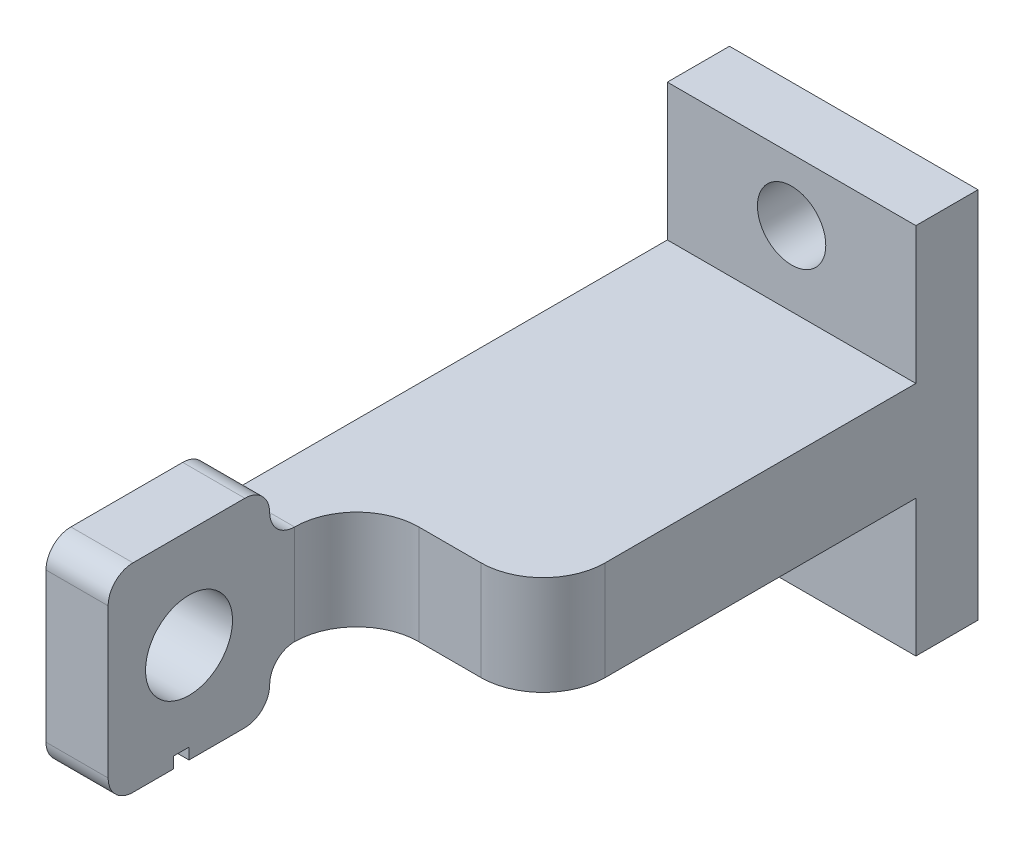
ISO-10303-21;
HEADER;
FILE_DESCRIPTION(('STEP AP214'),'2;1');
FILE_NAME('part.step','',(''),(''),'','','');
FILE_SCHEMA(('AUTOMOTIVE_DESIGN { 1 0 10303 214 1 1 1 1 }'));
ENDSEC;
DATA;
#1=APPLICATION_CONTEXT('core data for automotive mechanical design processes');
#2=APPLICATION_PROTOCOL_DEFINITION('international standard','automotive_design',2000,#1);
#3=PRODUCT_CONTEXT('',#1,'mechanical');
#4=PRODUCT('Part','Part','',(#3));
#5=PRODUCT_RELATED_PRODUCT_CATEGORY('part','',(#4));
#6=PRODUCT_DEFINITION_FORMATION('','',#4);
#7=PRODUCT_DEFINITION_CONTEXT('part definition',#1,'design');
#8=PRODUCT_DEFINITION('design','',#6,#7);
#9=PRODUCT_DEFINITION_SHAPE('','',#8);
#10=(LENGTH_UNIT() NAMED_UNIT(*) SI_UNIT(.MILLI.,.METRE.));
#11=(NAMED_UNIT(*) PLANE_ANGLE_UNIT() SI_UNIT($,.RADIAN.));
#12=(NAMED_UNIT(*) SI_UNIT($,.STERADIAN.) SOLID_ANGLE_UNIT());
#13=UNCERTAINTY_MEASURE_WITH_UNIT(LENGTH_MEASURE(1.E-05),#10,'distance_accuracy_value','');
#14=(GEOMETRIC_REPRESENTATION_CONTEXT(3) GLOBAL_UNCERTAINTY_ASSIGNED_CONTEXT((#13)) GLOBAL_UNIT_ASSIGNED_CONTEXT((#10,
#11,#12)) REPRESENTATION_CONTEXT('',''));
#15=CARTESIAN_POINT('',(0.,0.,0.));
#16=DIRECTION('',(0.,0.,1.));
#17=DIRECTION('',(1.,0.,0.));
#18=AXIS2_PLACEMENT_3D('',#15,#16,#17);
#19=CARTESIAN_POINT('',(10.,-35.7591402081995,0.));
#20=DIRECTION('',(0.,1.,0.));
#21=DIRECTION('',(-1.,0.,0.));
#22=AXIS2_PLACEMENT_3D('',#19,#20,#21);
#23=PLANE('',#22);
#24=DIRECTION('',(0.,0.,-1.));
#25=VECTOR('',#24,1.);
#26=CARTESIAN_POINT('',(5.,-35.7591402081995,0.));
#27=LINE('',#26,#25);
#28=CARTESIAN_POINT('',(5.,-35.7591402081995,48.4905528775903));
#29=VERTEX_POINT('',#28);
#30=CARTESIAN_POINT('',(5.,-35.7591402081995,44.));
#31=VERTEX_POINT('',#30);
#32=EDGE_CURVE('E235',#29,#31,#27,.T.);
#33=ORIENTED_EDGE('',*,*,#32,.T.);
#34=DIRECTION('',(-1.,0.,0.));
#35=VECTOR('',#34,1.);
#36=CARTESIAN_POINT('',(10.,-35.7591402081995,44.));
#37=LINE('',#36,#35);
#38=CARTESIAN_POINT('',(10.,-35.7591402081995,44.));
#39=VERTEX_POINT('',#38);
#40=EDGE_CURVE('E353',#31,#39,#37,.F.);
#41=ORIENTED_EDGE('',*,*,#40,.T.);
#42=DIRECTION('',(0.,0.,-1.));
#43=VECTOR('',#42,1.);
#44=CARTESIAN_POINT('',(10.,-35.7591402081995,0.));
#45=LINE('',#44,#43);
#46=CARTESIAN_POINT('',(10.,-35.7591402081995,48.4905528775903));
#47=VERTEX_POINT('',#46);
#48=EDGE_CURVE('E242',#47,#39,#45,.T.);
#49=ORIENTED_EDGE('',*,*,#48,.F.);
#50=DIRECTION('',(-1.,0.,0.));
#51=VECTOR('',#50,1.);
#52=CARTESIAN_POINT('',(10.,-35.7591402081995,48.4905528775903));
#53=LINE('',#52,#51);
#54=EDGE_CURVE('E198',#47,#29,#53,.T.);
#55=ORIENTED_EDGE('',*,*,#54,.T.);
#56=EDGE_LOOP('',(#33,#41,#49,#55));
#57=FACE_BOUND('',#56,.T.);
#58=ADVANCED_FACE('F35',(#57),#23,.F.);
#59=CARTESIAN_POINT('',(0.,-23.7591402081995,55.));
#60=DIRECTION('',(0.,-1.,0.));
#61=DIRECTION('',(0.,0.,-1.));
#62=AXIS2_PLACEMENT_3D('',#59,#60,#61);
#63=PLANE('',#62);
#64=DIRECTION('',(0.,0.,-1.));
#65=VECTOR('',#64,1.);
#66=CARTESIAN_POINT('',(5.,-23.7591402081995,55.));
#67=LINE('',#66,#65);
#68=CARTESIAN_POINT('',(5.,-23.7591402081995,40.));
#69=VERTEX_POINT('',#68);
#70=CARTESIAN_POINT('',(5.,-23.7591402081995,5.));
#71=VERTEX_POINT('',#70);
#72=EDGE_CURVE('E264',#69,#71,#67,.T.);
#73=ORIENTED_EDGE('',*,*,#72,.F.);
#74=DIRECTION('',(-1.,0.,0.));
#75=VECTOR('',#74,1.);
#76=CARTESIAN_POINT('',(10.,-23.7591402081995,40.));
#77=LINE('',#76,#75);
#78=CARTESIAN_POINT('',(10.,-23.7591402081995,40.));
#79=VERTEX_POINT('',#78);
#80=EDGE_CURVE('E339',#69,#79,#77,.F.);
#81=ORIENTED_EDGE('',*,*,#80,.T.);
#82=CARTESIAN_POINT('',(15.,-23.7591402081995,40.));
#83=DIRECTION('',(0.,-1.,0.));
#84=DIRECTION('',(0.,0.,-1.));
#85=AXIS2_PLACEMENT_3D('',#82,#83,#84);
#86=CIRCLE('',#85,5.);
#87=CARTESIAN_POINT('',(15.,-23.7591402081995,35.));
#88=VERTEX_POINT('',#87);
#89=EDGE_CURVE('E332',#79,#88,#86,.T.);
#90=ORIENTED_EDGE('',*,*,#89,.T.);
#91=DIRECTION('',(-1.,0.,0.));
#92=VECTOR('',#91,1.);
#93=CARTESIAN_POINT('',(25.,-23.7591402081995,35.));
#94=LINE('',#93,#92);
#95=CARTESIAN_POINT('',(20.,-23.7591402081995,35.));
#96=VERTEX_POINT('',#95);
#97=EDGE_CURVE('E247',#96,#88,#94,.T.);
#98=ORIENTED_EDGE('',*,*,#97,.F.);
#99=CARTESIAN_POINT('',(20.,-23.7591402081995,30.));
#100=DIRECTION('',(0.,-1.,0.));
#101=DIRECTION('',(0.,0.,-1.));
#102=AXIS2_PLACEMENT_3D('',#99,#100,#101);
#103=CIRCLE('',#102,5.);
#104=CARTESIAN_POINT('',(25.,-23.7591402081995,30.));
#105=VERTEX_POINT('',#104);
#106=EDGE_CURVE('E320',#96,#105,#103,.F.);
#107=ORIENTED_EDGE('',*,*,#106,.T.);
#108=DIRECTION('',(0.,0.,-1.));
#109=VECTOR('',#108,1.);
#110=CARTESIAN_POINT('',(25.,-23.7591402081995,55.));
#111=LINE('',#110,#109);
#112=CARTESIAN_POINT('',(25.,-23.7591402081995,5.));
#113=VERTEX_POINT('',#112);
#114=EDGE_CURVE('E266',#105,#113,#111,.T.);
#115=ORIENTED_EDGE('',*,*,#114,.T.);
#116=DIRECTION('',(-1.,0.,0.));
#117=VECTOR('',#116,1.);
#118=CARTESIAN_POINT('',(0.,-23.7591402081995,5.));
#119=LINE('',#118,#117);
#120=EDGE_CURVE('E252',#113,#71,#119,.T.);
#121=ORIENTED_EDGE('',*,*,#120,.T.);
#122=EDGE_LOOP('',(#73,#81,#90,#98,#107,#115,#121));
#123=FACE_BOUND('',#122,.T.);
#124=ADVANCED_FACE('F410',(#123),#63,.F.);
#125=CARTESIAN_POINT('',(0.,-31.7591402081995,55.));
#126=DIRECTION('',(0.,-1.,0.));
#127=DIRECTION('',(0.,0.,-1.));
#128=AXIS2_PLACEMENT_3D('',#125,#126,#127);
#129=PLANE('',#128);
#130=CARTESIAN_POINT('',(15.,-31.7591402081995,40.));
#131=DIRECTION('',(0.,-1.,0.));
#132=DIRECTION('',(0.,0.,-1.));
#133=AXIS2_PLACEMENT_3D('',#130,#131,#132);
#134=CIRCLE('',#133,5.);
#135=CARTESIAN_POINT('',(15.,-31.7591402081995,35.));
#136=VERTEX_POINT('',#135);
#137=CARTESIAN_POINT('',(10.,-31.7591402081995,40.));
#138=VERTEX_POINT('',#137);
#139=EDGE_CURVE('E329',#136,#138,#134,.F.);
#140=ORIENTED_EDGE('',*,*,#139,.T.);
#141=DIRECTION('',(-1.,0.,0.));
#142=VECTOR('',#141,1.);
#143=CARTESIAN_POINT('',(0.,-31.7591402081995,40.));
#144=LINE('',#143,#142);
#145=CARTESIAN_POINT('',(5.,-31.7591402081995,40.));
#146=VERTEX_POINT('',#145);
#147=EDGE_CURVE('E342',#138,#146,#144,.T.);
#148=ORIENTED_EDGE('',*,*,#147,.T.);
#149=DIRECTION('',(0.,0.,-1.));
#150=VECTOR('',#149,1.);
#151=CARTESIAN_POINT('',(5.,-31.7591402081995,55.));
#152=LINE('',#151,#150);
#153=CARTESIAN_POINT('',(5.,-31.7591402081995,5.));
#154=VERTEX_POINT('',#153);
#155=EDGE_CURVE('E262',#146,#154,#152,.T.);
#156=ORIENTED_EDGE('',*,*,#155,.T.);
#157=DIRECTION('',(-1.,0.,0.));
#158=VECTOR('',#157,1.);
#159=CARTESIAN_POINT('',(0.,-31.7591402081995,5.));
#160=LINE('',#159,#158);
#161=CARTESIAN_POINT('',(25.,-31.7591402081995,5.));
#162=VERTEX_POINT('',#161);
#163=EDGE_CURVE('E256',#162,#154,#160,.T.);
#164=ORIENTED_EDGE('',*,*,#163,.F.);
#165=DIRECTION('',(0.,0.,-1.));
#166=VECTOR('',#165,1.);
#167=CARTESIAN_POINT('',(25.,-31.7591402081995,55.));
#168=LINE('',#167,#166);
#169=CARTESIAN_POINT('',(25.,-31.7591402081995,30.));
#170=VERTEX_POINT('',#169);
#171=EDGE_CURVE('E255',#170,#162,#168,.T.);
#172=ORIENTED_EDGE('',*,*,#171,.F.);
#173=CARTESIAN_POINT('',(20.,-31.7591402081995,30.));
#174=DIRECTION('',(0.,-1.,0.));
#175=DIRECTION('',(0.,0.,-1.));
#176=AXIS2_PLACEMENT_3D('',#173,#174,#175);
#177=CIRCLE('',#176,5.);
#178=CARTESIAN_POINT('',(20.,-31.7591402081995,35.));
#179=VERTEX_POINT('',#178);
#180=EDGE_CURVE('E324',#170,#179,#177,.T.);
#181=ORIENTED_EDGE('',*,*,#180,.T.);
#182=DIRECTION('',(1.,0.,0.));
#183=VECTOR('',#182,1.);
#184=CARTESIAN_POINT('',(10.,-31.7591402081995,35.));
#185=LINE('',#184,#183);
#186=EDGE_CURVE('E241',#136,#179,#185,.T.);
#187=ORIENTED_EDGE('',*,*,#186,.F.);
#188=EDGE_LOOP('',(#140,#148,#156,#164,#172,#181,#187));
#189=FACE_BOUND('',#188,.T.);
#190=ADVANCED_FACE('F403',(#189),#129,.T.);
#191=CARTESIAN_POINT('',(25.,0.,5.));
#192=DIRECTION('',(1.,0.,0.));
#193=DIRECTION('',(0.,1.,0.));
#194=AXIS2_PLACEMENT_3D('',#191,#192,#193);
#195=PLANE('',#194);
#196=ORIENTED_EDGE('',*,*,#114,.F.);
#197=DIRECTION('',(0.,1.,0.));
#198=VECTOR('',#197,1.);
#199=CARTESIAN_POINT('',(25.,0.,30.));
#200=LINE('',#199,#198);
#201=EDGE_CURVE('E322',#105,#170,#200,.F.);
#202=ORIENTED_EDGE('',*,*,#201,.T.);
#203=ORIENTED_EDGE('',*,*,#171,.T.);
#204=DIRECTION('',(0.,-1.,0.));
#205=VECTOR('',#204,1.);
#206=CARTESIAN_POINT('',(25.,0.,5.));
#207=LINE('',#206,#205);
#208=CARTESIAN_POINT('',(25.,-42.7591402081995,5.));
#209=VERTEX_POINT('',#208);
#210=EDGE_CURVE('E273',#162,#209,#207,.T.);
#211=ORIENTED_EDGE('',*,*,#210,.T.);
#212=DIRECTION('',(0.,0.,-1.));
#213=VECTOR('',#212,1.);
#214=CARTESIAN_POINT('',(25.,-42.7591402081995,5.));
#215=LINE('',#214,#213);
#216=CARTESIAN_POINT('',(25.,-42.7591402081995,0.));
#217=VERTEX_POINT('',#216);
#218=EDGE_CURVE('E289',#209,#217,#215,.T.);
#219=ORIENTED_EDGE('',*,*,#218,.T.);
#220=DIRECTION('',(0.,-1.,0.));
#221=VECTOR('',#220,1.);
#222=CARTESIAN_POINT('',(25.,0.,0.));
#223=LINE('',#222,#221);
#224=CARTESIAN_POINT('',(25.,-12.7591402081995,0.));
#225=VERTEX_POINT('',#224);
#226=EDGE_CURVE('E268',#225,#217,#223,.T.);
#227=ORIENTED_EDGE('',*,*,#226,.F.);
#228=DIRECTION('',(0.,0.,-1.));
#229=VECTOR('',#228,1.);
#230=CARTESIAN_POINT('',(25.,-12.7591402081995,5.));
#231=LINE('',#230,#229);
#232=CARTESIAN_POINT('',(25.,-12.7591402081995,5.));
#233=VERTEX_POINT('',#232);
#234=EDGE_CURVE('E312',#233,#225,#231,.T.);
#235=ORIENTED_EDGE('',*,*,#234,.F.);
#236=EDGE_CURVE('E269',#233,#113,#207,.T.);
#237=ORIENTED_EDGE('',*,*,#236,.T.);
#238=EDGE_LOOP('',(#196,#202,#203,#211,#219,#227,#235,#237));
#239=FACE_BOUND('',#238,.T.);
#240=ADVANCED_FACE('F422',(#239),#195,.T.);
#241=CARTESIAN_POINT('',(0.,0.,5.));
#242=DIRECTION('',(0.,0.,1.));
#243=DIRECTION('',(1.,0.,0.));
#244=AXIS2_PLACEMENT_3D('',#241,#242,#243);
#245=PLANE('',#244);
#246=CARTESIAN_POINT('',(15.,-35.9197134027332,5.));
#247=DIRECTION('',(0.,0.,1.));
#248=DIRECTION('',(1.,0.,0.));
#249=AXIS2_PLACEMENT_3D('',#246,#247,#248);
#250=CIRCLE('',#249,2.75);
#251=CARTESIAN_POINT('',(17.75,-35.9197134027332,5.));
#252=VERTEX_POINT('',#251);
#253=EDGE_CURVE('E286',#252,#252,#250,.T.);
#254=ORIENTED_EDGE('',*,*,#253,.F.);
#255=EDGE_LOOP('',(#254));
#256=FACE_BOUND('',#255,.T.);
#257=ORIENTED_EDGE('',*,*,#210,.F.);
#258=ORIENTED_EDGE('',*,*,#163,.T.);
#259=DIRECTION('',(0.,1.,0.));
#260=VECTOR('',#259,1.);
#261=CARTESIAN_POINT('',(5.,0.,5.));
#262=LINE('',#261,#260);
#263=CARTESIAN_POINT('',(5.,-42.7591402081995,5.));
#264=VERTEX_POINT('',#263);
#265=EDGE_CURVE('E277',#264,#154,#262,.T.);
#266=ORIENTED_EDGE('',*,*,#265,.F.);
#267=DIRECTION('',(-1.,0.,0.));
#268=VECTOR('',#267,1.);
#269=CARTESIAN_POINT('',(0.,-42.7591402081995,5.));
#270=LINE('',#269,#268);
#271=EDGE_CURVE('E280',#209,#264,#270,.T.);
#272=ORIENTED_EDGE('',*,*,#271,.F.);
#273=EDGE_LOOP('',(#257,#258,#266,#272));
#274=FACE_BOUND('',#273,.T.);
#275=ADVANCED_FACE('F640',(#256,#274),#245,.T.);
#276=CARTESIAN_POINT('',(0.,-12.7591402081995,5.));
#277=DIRECTION('',(0.,1.,0.));
#278=DIRECTION('',(0.,0.,1.));
#279=AXIS2_PLACEMENT_3D('',#276,#277,#278);
#280=PLANE('',#279);
#281=DIRECTION('',(1.,0.,0.));
#282=VECTOR('',#281,1.);
#283=CARTESIAN_POINT('',(0.,-12.7591402081995,0.));
#284=LINE('',#283,#282);
#285=CARTESIAN_POINT('',(5.,-12.7591402081995,0.));
#286=VERTEX_POINT('',#285);
#287=EDGE_CURVE('E292',#286,#225,#284,.T.);
#288=ORIENTED_EDGE('',*,*,#287,.F.);
#289=DIRECTION('',(0.,0.,-1.));
#290=VECTOR('',#289,1.);
#291=CARTESIAN_POINT('',(5.,-12.7591402081995,5.));
#292=LINE('',#291,#290);
#293=CARTESIAN_POINT('',(5.,-12.7591402081995,5.));
#294=VERTEX_POINT('',#293);
#295=EDGE_CURVE('E310',#294,#286,#292,.T.);
#296=ORIENTED_EDGE('',*,*,#295,.F.);
#297=DIRECTION('',(1.,0.,0.));
#298=VECTOR('',#297,1.);
#299=CARTESIAN_POINT('',(0.,-12.7591402081995,5.));
#300=LINE('',#299,#298);
#301=EDGE_CURVE('E272',#294,#233,#300,.T.);
#302=ORIENTED_EDGE('',*,*,#301,.T.);
#303=ORIENTED_EDGE('',*,*,#234,.T.);
#304=EDGE_LOOP('',(#288,#296,#302,#303));
#305=FACE_BOUND('',#304,.T.);
#306=ADVANCED_FACE('F434',(#305),#280,.T.);
#307=CARTESIAN_POINT('',(5.,0.,5.));
#308=DIRECTION('',(-1.,0.,0.));
#309=DIRECTION('',(0.,-1.,0.));
#310=AXIS2_PLACEMENT_3D('',#307,#308,#309);
#311=PLANE('',#310);
#312=ORIENTED_EDGE('',*,*,#155,.F.);
#313=CARTESIAN_POINT('',(5.,-33.7591402081995,40.));
#314=DIRECTION('',(-1.,0.,0.));
#315=DIRECTION('',(0.,-1.,0.));
#316=AXIS2_PLACEMENT_3D('',#313,#314,#315);
#317=CIRCLE('',#316,2.);
#318=CARTESIAN_POINT('',(5.,-33.7591402081995,42.));
#319=VERTEX_POINT('',#318);
#320=EDGE_CURVE('E44',#146,#319,#317,.F.);
#321=ORIENTED_EDGE('',*,*,#320,.T.);
#322=CARTESIAN_POINT('',(5.,-33.7591402081995,44.));
#323=DIRECTION('',(-1.,0.,0.));
#324=DIRECTION('',(0.,-1.,0.));
#325=AXIS2_PLACEMENT_3D('',#322,#323,#324);
#326=CIRCLE('',#325,2.);
#327=EDGE_CURVE('E351',#319,#31,#326,.T.);
#328=ORIENTED_EDGE('',*,*,#327,.T.);
#329=ORIENTED_EDGE('',*,*,#32,.F.);
#330=DIRECTION('',(0.,1.,0.));
#331=VECTOR('',#330,1.);
#332=CARTESIAN_POINT('',(5.,0.,48.4905528775903));
#333=LINE('',#332,#331);
#334=CARTESIAN_POINT('',(5.,-34.8591402081995,48.4905528775903));
#335=VERTEX_POINT('',#334);
#336=EDGE_CURVE('E218',#29,#335,#333,.T.);
#337=ORIENTED_EDGE('',*,*,#336,.T.);
#338=DIRECTION('',(0.,0.,1.));
#339=VECTOR('',#338,1.);
#340=CARTESIAN_POINT('',(5.,-34.8591402081995,0.));
#341=LINE('',#340,#339);
#342=CARTESIAN_POINT('',(5.,-34.8591402081995,49.7405528775903));
#343=VERTEX_POINT('',#342);
#344=EDGE_CURVE('E210',#335,#343,#341,.T.);
#345=ORIENTED_EDGE('',*,*,#344,.T.);
#346=DIRECTION('',(0.,1.,0.));
#347=VECTOR('',#346,1.);
#348=CARTESIAN_POINT('',(5.,0.,49.7405528775903));
#349=LINE('',#348,#347);
#350=CARTESIAN_POINT('',(5.,-35.7591402081995,49.7405528775903));
#351=VERTEX_POINT('',#350);
#352=EDGE_CURVE('E216',#351,#343,#349,.T.);
#353=ORIENTED_EDGE('',*,*,#352,.F.);
#354=CARTESIAN_POINT('',(5.,-35.7591402081995,53.));
#355=VERTEX_POINT('',#354);
#356=EDGE_CURVE('E243',#355,#351,#27,.T.);
#357=ORIENTED_EDGE('',*,*,#356,.F.);
#358=CARTESIAN_POINT('',(5.,-33.7591402081995,53.));
#359=DIRECTION('',(-1.,0.,0.));
#360=DIRECTION('',(0.,-1.,0.));
#361=AXIS2_PLACEMENT_3D('',#358,#359,#360);
#362=CIRCLE('',#361,2.);
#363=CARTESIAN_POINT('',(5.,-33.7591402081995,55.));
#364=VERTEX_POINT('',#363);
#365=EDGE_CURVE('E345',#355,#364,#362,.T.);
#366=ORIENTED_EDGE('',*,*,#365,.T.);
#367=DIRECTION('',(0.,-1.,0.));
#368=VECTOR('',#367,1.);
#369=CARTESIAN_POINT('',(5.,0.,55.));
#370=LINE('',#369,#368);
#371=CARTESIAN_POINT('',(5.,-21.7591402081995,55.));
#372=VERTEX_POINT('',#371);
#373=EDGE_CURVE('E253',#372,#364,#370,.T.);
#374=ORIENTED_EDGE('',*,*,#373,.F.);
#375=CARTESIAN_POINT('',(5.,-21.7591402081995,53.));
#376=DIRECTION('',(-1.,0.,0.));
#377=DIRECTION('',(0.,-1.,0.));
#378=AXIS2_PLACEMENT_3D('',#375,#376,#377);
#379=CIRCLE('',#378,2.);
#380=CARTESIAN_POINT('',(5.,-19.7591402081995,53.));
#381=VERTEX_POINT('',#380);
#382=EDGE_CURVE('E347',#372,#381,#379,.T.);
#383=ORIENTED_EDGE('',*,*,#382,.T.);
#384=DIRECTION('',(0.,0.,-1.));
#385=VECTOR('',#384,1.);
#386=CARTESIAN_POINT('',(5.,-19.7591402081995,0.));
#387=LINE('',#386,#385);
#388=CARTESIAN_POINT('',(5.,-19.7591402081995,44.));
#389=VERTEX_POINT('',#388);
#390=EDGE_CURVE('E236',#381,#389,#387,.T.);
#391=ORIENTED_EDGE('',*,*,#390,.T.);
#392=CARTESIAN_POINT('',(5.,-21.7591402081995,44.));
#393=DIRECTION('',(-1.,0.,0.));
#394=DIRECTION('',(0.,-1.,0.));
#395=AXIS2_PLACEMENT_3D('',#392,#393,#394);
#396=CIRCLE('',#395,2.);
#397=CARTESIAN_POINT('',(5.,-21.7591402081995,42.));
#398=VERTEX_POINT('',#397);
#399=EDGE_CURVE('E349',#389,#398,#396,.T.);
#400=ORIENTED_EDGE('',*,*,#399,.T.);
#401=CARTESIAN_POINT('',(5.,-21.7591402081995,40.));
#402=DIRECTION('',(-1.,0.,0.));
#403=DIRECTION('',(0.,-1.,0.));
#404=AXIS2_PLACEMENT_3D('',#401,#402,#403);
#405=CIRCLE('',#404,2.);
#406=EDGE_CURVE('E373',#398,#69,#405,.F.);
#407=ORIENTED_EDGE('',*,*,#406,.T.);
#408=ORIENTED_EDGE('',*,*,#72,.T.);
#409=EDGE_CURVE('E276',#71,#294,#262,.T.);
#410=ORIENTED_EDGE('',*,*,#409,.T.);
#411=ORIENTED_EDGE('',*,*,#295,.T.);
#412=DIRECTION('',(0.,1.,0.));
#413=VECTOR('',#412,1.);
#414=CARTESIAN_POINT('',(5.,0.,0.));
#415=LINE('',#414,#413);
#416=CARTESIAN_POINT('',(5.,-42.7591402081995,0.));
#417=VERTEX_POINT('',#416);
#418=EDGE_CURVE('E295',#417,#286,#415,.T.);
#419=ORIENTED_EDGE('',*,*,#418,.F.);
#420=DIRECTION('',(0.,0.,-1.));
#421=VECTOR('',#420,1.);
#422=CARTESIAN_POINT('',(5.,-42.7591402081995,5.));
#423=LINE('',#422,#421);
#424=EDGE_CURVE('E308',#264,#417,#423,.T.);
#425=ORIENTED_EDGE('',*,*,#424,.F.);
#426=ORIENTED_EDGE('',*,*,#265,.T.);
#427=EDGE_LOOP('',(#312,#321,#328,#329,#337,#345,#353,#357,#366,#374,#383,#391,#400,#407,#408,
#410,#411,#419,#425,#426));
#428=FACE_BOUND('',#427,.T.);
#429=CARTESIAN_POINT('',(5.,-27.7591402081995,48.4905528775903));
#430=DIRECTION('',(-1.,0.,0.));
#431=DIRECTION('',(0.,-1.,0.));
#432=AXIS2_PLACEMENT_3D('',#429,#430,#431);
#433=CIRCLE('',#432,3.5);
#434=CARTESIAN_POINT('',(5.,-31.2591402081995,48.4905528775903));
#435=VERTEX_POINT('',#434);
#436=EDGE_CURVE('E227',#435,#435,#433,.T.);
#437=ORIENTED_EDGE('',*,*,#436,.F.);
#438=EDGE_LOOP('',(#437));
#439=FACE_BOUND('',#438,.T.);
#440=ADVANCED_FACE('F396',(#428,#439),#311,.T.);
#441=CARTESIAN_POINT('',(15.,-17.7591402081995,5.));
#442=DIRECTION('',(0.,0.,-1.));
#443=DIRECTION('',(-1.,0.,0.));
#444=AXIS2_PLACEMENT_3D('',#441,#442,#443);
#445=CYLINDRICAL_SURFACE('',#444,2.75);
#446=CARTESIAN_POINT('',(15.,-17.7591402081995,5.));
#447=DIRECTION('',(0.,0.,1.));
#448=DIRECTION('',(1.,0.,0.));
#449=AXIS2_PLACEMENT_3D('',#446,#447,#448);
#450=CIRCLE('',#449,2.75);
#451=CARTESIAN_POINT('',(17.75,-17.7591402081995,5.));
#452=VERTEX_POINT('',#451);
#453=EDGE_CURVE('E283',#452,#452,#450,.T.);
#454=ORIENTED_EDGE('',*,*,#453,.T.);
#455=EDGE_LOOP('',(#454));
#456=FACE_BOUND('',#455,.T.);
#457=CARTESIAN_POINT('',(15.,-17.7591402081995,0.));
#458=DIRECTION('',(0.,0.,1.));
#459=DIRECTION('',(1.,0.,0.));
#460=AXIS2_PLACEMENT_3D('',#457,#458,#459);
#461=CIRCLE('',#460,2.75);
#462=CARTESIAN_POINT('',(17.75,-17.7591402081995,0.));
#463=VERTEX_POINT('',#462);
#464=EDGE_CURVE('E301',#463,#463,#461,.T.);
#465=ORIENTED_EDGE('',*,*,#464,.F.);
#466=EDGE_LOOP('',(#465));
#467=FACE_BOUND('',#466,.T.);
#468=ADVANCED_FACE('F584',(#456,#467),#445,.F.);
#469=CARTESIAN_POINT('',(0.,-42.7591402081995,5.));
#470=DIRECTION('',(0.,-1.,0.));
#471=DIRECTION('',(0.,0.,-1.));
#472=AXIS2_PLACEMENT_3D('',#469,#470,#471);
#473=PLANE('',#472);
#474=DIRECTION('',(-1.,0.,0.));
#475=VECTOR('',#474,1.);
#476=CARTESIAN_POINT('',(0.,-42.7591402081995,0.));
#477=LINE('',#476,#475);
#478=EDGE_CURVE('E298',#217,#417,#477,.T.);
#479=ORIENTED_EDGE('',*,*,#478,.F.);
#480=ORIENTED_EDGE('',*,*,#218,.F.);
#481=ORIENTED_EDGE('',*,*,#271,.T.);
#482=ORIENTED_EDGE('',*,*,#424,.T.);
#483=EDGE_LOOP('',(#479,#480,#481,#482));
#484=FACE_BOUND('',#483,.T.);
#485=ADVANCED_FACE('F677',(#484),#473,.T.);
#486=CARTESIAN_POINT('',(15.,-35.9197134027332,5.));
#487=DIRECTION('',(0.,0.,-1.));
#488=DIRECTION('',(-1.,0.,0.));
#489=AXIS2_PLACEMENT_3D('',#486,#487,#488);
#490=CYLINDRICAL_SURFACE('',#489,2.75);
#491=ORIENTED_EDGE('',*,*,#253,.T.);
#492=EDGE_LOOP('',(#491));
#493=FACE_BOUND('',#492,.T.);
#494=CARTESIAN_POINT('',(15.,-35.9197134027332,0.));
#495=DIRECTION('',(0.,0.,1.));
#496=DIRECTION('',(1.,0.,0.));
#497=AXIS2_PLACEMENT_3D('',#494,#495,#496);
#498=CIRCLE('',#497,2.75);
#499=CARTESIAN_POINT('',(17.75,-35.9197134027332,0.));
#500=VERTEX_POINT('',#499);
#501=EDGE_CURVE('E304',#500,#500,#498,.T.);
#502=ORIENTED_EDGE('',*,*,#501,.F.);
#503=EDGE_LOOP('',(#502));
#504=FACE_BOUND('',#503,.T.);
#505=ADVANCED_FACE('F648',(#493,#504),#490,.F.);
#506=ORIENTED_EDGE('',*,*,#120,.F.);
#507=ORIENTED_EDGE('',*,*,#236,.F.);
#508=ORIENTED_EDGE('',*,*,#301,.F.);
#509=ORIENTED_EDGE('',*,*,#409,.F.);
#510=EDGE_LOOP('',(#506,#507,#508,#509));
#511=FACE_BOUND('',#510,.T.);
#512=ORIENTED_EDGE('',*,*,#453,.F.);
#513=EDGE_LOOP('',(#512));
#514=FACE_BOUND('',#513,.T.);
#515=ADVANCED_FACE('F428',(#511,#514),#245,.T.);
#516=CARTESIAN_POINT('',(0.,0.,0.));
#517=DIRECTION('',(0.,0.,1.));
#518=DIRECTION('',(1.,0.,0.));
#519=AXIS2_PLACEMENT_3D('',#516,#517,#518);
#520=PLANE('',#519);
#521=ORIENTED_EDGE('',*,*,#226,.T.);
#522=ORIENTED_EDGE('',*,*,#478,.T.);
#523=ORIENTED_EDGE('',*,*,#418,.T.);
#524=ORIENTED_EDGE('',*,*,#287,.T.);
#525=EDGE_LOOP('',(#521,#522,#523,#524));
#526=FACE_BOUND('',#525,.T.);
#527=ORIENTED_EDGE('',*,*,#464,.T.);
#528=EDGE_LOOP('',(#527));
#529=FACE_BOUND('',#528,.T.);
#530=ORIENTED_EDGE('',*,*,#501,.T.);
#531=EDGE_LOOP('',(#530));
#532=FACE_BOUND('',#531,.T.);
#533=ADVANCED_FACE('F575',(#526,#529,#532),#520,.F.);
#534=CARTESIAN_POINT('',(0.,0.,55.));
#535=DIRECTION('',(0.,0.,1.));
#536=DIRECTION('',(1.,0.,0.));
#537=AXIS2_PLACEMENT_3D('',#534,#535,#536);
#538=PLANE('',#537);
#539=DIRECTION('',(0.,-1.,0.));
#540=VECTOR('',#539,1.);
#541=CARTESIAN_POINT('',(10.,-23.7591402081995,55.));
#542=LINE('',#541,#540);
#543=CARTESIAN_POINT('',(10.,-21.7591402081995,55.));
#544=VERTEX_POINT('',#543);
#545=CARTESIAN_POINT('',(10.,-33.7591402081995,55.));
#546=VERTEX_POINT('',#545);
#547=EDGE_CURVE('E250',#544,#546,#542,.T.);
#548=ORIENTED_EDGE('',*,*,#547,.F.);
#549=DIRECTION('',(-1.,0.,0.));
#550=VECTOR('',#549,1.);
#551=CARTESIAN_POINT('',(0.,-21.7591402081995,55.));
#552=LINE('',#551,#550);
#553=EDGE_CURVE('E367',#544,#372,#552,.T.);
#554=ORIENTED_EDGE('',*,*,#553,.T.);
#555=ORIENTED_EDGE('',*,*,#373,.T.);
#556=DIRECTION('',(-1.,0.,0.));
#557=VECTOR('',#556,1.);
#558=CARTESIAN_POINT('',(10.,-33.7591402081995,55.));
#559=LINE('',#558,#557);
#560=EDGE_CURVE('E52',#364,#546,#559,.F.);
#561=ORIENTED_EDGE('',*,*,#560,.T.);
#562=EDGE_LOOP('',(#548,#554,#555,#561));
#563=FACE_BOUND('',#562,.T.);
#564=ADVANCED_FACE('F450',(#563),#538,.T.);
#565=CARTESIAN_POINT('',(10.,-23.7591402081995,40.));
#566=DIRECTION('',(-1.,0.,0.));
#567=DIRECTION('',(0.,0.,1.));
#568=AXIS2_PLACEMENT_3D('',#565,#566,#567);
#569=PLANE('',#568);
#570=CARTESIAN_POINT('',(10.,-27.7591402081995,48.4905528775903));
#571=DIRECTION('',(-1.,0.,0.));
#572=DIRECTION('',(0.,0.,1.));
#573=AXIS2_PLACEMENT_3D('',#570,#571,#572);
#574=CIRCLE('',#573,3.5);
#575=CARTESIAN_POINT('',(10.,-27.7591402081995,51.9905528775903));
#576=VERTEX_POINT('',#575);
#577=EDGE_CURVE('E231',#576,#576,#574,.T.);
#578=ORIENTED_EDGE('',*,*,#577,.T.);
#579=EDGE_LOOP('',(#578));
#580=FACE_BOUND('',#579,.T.);
#581=ORIENTED_EDGE('',*,*,#48,.T.);
#582=CARTESIAN_POINT('',(10.,-33.7591402081995,44.));
#583=DIRECTION('',(-1.,0.,0.));
#584=DIRECTION('',(0.,0.,1.));
#585=AXIS2_PLACEMENT_3D('',#582,#583,#584);
#586=CIRCLE('',#585,2.);
#587=CARTESIAN_POINT('',(10.,-33.7591402081995,42.));
#588=VERTEX_POINT('',#587);
#589=EDGE_CURVE('E360',#39,#588,#586,.F.);
#590=ORIENTED_EDGE('',*,*,#589,.T.);
#591=CARTESIAN_POINT('',(10.,-33.7591402081995,40.));
#592=DIRECTION('',(-1.,0.,0.));
#593=DIRECTION('',(0.,0.,1.));
#594=AXIS2_PLACEMENT_3D('',#591,#592,#593);
#595=CIRCLE('',#594,2.);
#596=EDGE_CURVE('E11',#588,#138,#595,.T.);
#597=ORIENTED_EDGE('',*,*,#596,.T.);
#598=DIRECTION('',(0.,-1.,0.));
#599=VECTOR('',#598,1.);
#600=CARTESIAN_POINT('',(10.,-23.7591402081995,40.));
#601=LINE('',#600,#599);
#602=EDGE_CURVE('E326',#138,#79,#601,.F.);
#603=ORIENTED_EDGE('',*,*,#602,.T.);
#604=CARTESIAN_POINT('',(10.,-21.7591402081995,40.));
#605=DIRECTION('',(-1.,0.,0.));
#606=DIRECTION('',(0.,0.,1.));
#607=AXIS2_PLACEMENT_3D('',#604,#605,#606);
#608=CIRCLE('',#607,2.);
#609=CARTESIAN_POINT('',(10.,-21.7591402081995,42.));
#610=VERTEX_POINT('',#609);
#611=EDGE_CURVE('E375',#79,#610,#608,.T.);
#612=ORIENTED_EDGE('',*,*,#611,.T.);
#613=CARTESIAN_POINT('',(10.,-21.7591402081995,44.));
#614=DIRECTION('',(-1.,0.,0.));
#615=DIRECTION('',(0.,0.,1.));
#616=AXIS2_PLACEMENT_3D('',#613,#614,#615);
#617=CIRCLE('',#616,2.);
#618=CARTESIAN_POINT('',(10.,-19.7591402081995,44.));
#619=VERTEX_POINT('',#618);
#620=EDGE_CURVE('E358',#610,#619,#617,.F.);
#621=ORIENTED_EDGE('',*,*,#620,.T.);
#622=DIRECTION('',(0.,0.,-1.));
#623=VECTOR('',#622,1.);
#624=CARTESIAN_POINT('',(10.,-19.7591402081995,0.));
#625=LINE('',#624,#623);
#626=CARTESIAN_POINT('',(10.,-19.7591402081995,53.));
#627=VERTEX_POINT('',#626);
#628=EDGE_CURVE('E232',#627,#619,#625,.T.);
#629=ORIENTED_EDGE('',*,*,#628,.F.);
#630=CARTESIAN_POINT('',(10.,-21.7591402081995,53.));
#631=DIRECTION('',(-1.,0.,0.));
#632=DIRECTION('',(0.,0.,1.));
#633=AXIS2_PLACEMENT_3D('',#630,#631,#632);
#634=CIRCLE('',#633,2.);
#635=EDGE_CURVE('E59',#627,#544,#634,.F.);
#636=ORIENTED_EDGE('',*,*,#635,.T.);
#637=ORIENTED_EDGE('',*,*,#547,.T.);
#638=CARTESIAN_POINT('',(10.,-33.7591402081995,53.));
#639=DIRECTION('',(-1.,0.,0.));
#640=DIRECTION('',(0.,0.,1.));
#641=AXIS2_PLACEMENT_3D('',#638,#639,#640);
#642=CIRCLE('',#641,2.);
#643=CARTESIAN_POINT('',(10.,-35.7591402081995,53.));
#644=VERTEX_POINT('',#643);
#645=EDGE_CURVE('E355',#546,#644,#642,.F.);
#646=ORIENTED_EDGE('',*,*,#645,.T.);
#647=CARTESIAN_POINT('',(10.,-35.7591402081995,49.7405528775903));
#648=VERTEX_POINT('',#647);
#649=EDGE_CURVE('E239',#644,#648,#45,.T.);
#650=ORIENTED_EDGE('',*,*,#649,.T.);
#651=DIRECTION('',(0.,1.,0.));
#652=VECTOR('',#651,1.);
#653=CARTESIAN_POINT('',(10.,0.,49.7405528775903));
#654=LINE('',#653,#652);
#655=CARTESIAN_POINT('',(10.,-34.8591402081995,49.7405528775903));
#656=VERTEX_POINT('',#655);
#657=EDGE_CURVE('E202',#648,#656,#654,.T.);
#658=ORIENTED_EDGE('',*,*,#657,.T.);
#659=DIRECTION('',(0.,0.,1.));
#660=VECTOR('',#659,1.);
#661=CARTESIAN_POINT('',(10.,-34.8591402081995,0.));
#662=LINE('',#661,#660);
#663=CARTESIAN_POINT('',(10.,-34.8591402081995,48.4905528775903));
#664=VERTEX_POINT('',#663);
#665=EDGE_CURVE('E203',#664,#656,#662,.T.);
#666=ORIENTED_EDGE('',*,*,#665,.F.);
#667=DIRECTION('',(0.,1.,0.));
#668=VECTOR('',#667,1.);
#669=CARTESIAN_POINT('',(10.,0.,48.4905528775903));
#670=LINE('',#669,#668);
#671=EDGE_CURVE('E192',#47,#664,#670,.T.);
#672=ORIENTED_EDGE('',*,*,#671,.F.);
#673=EDGE_LOOP('',(#581,#590,#597,#603,#612,#621,#629,#636,#637,#646,#650,#658,#666,#672));
#674=FACE_BOUND('',#673,.T.);
#675=ADVANCED_FACE('F214',(#580,#674),#569,.F.);
#676=CARTESIAN_POINT('',(0.,0.,35.));
#677=DIRECTION('',(0.,0.,1.));
#678=DIRECTION('',(1.,0.,0.));
#679=AXIS2_PLACEMENT_3D('',#676,#677,#678);
#680=PLANE('',#679);
#681=ORIENTED_EDGE('',*,*,#186,.T.);
#682=DIRECTION('',(0.,1.,0.));
#683=VECTOR('',#682,1.);
#684=CARTESIAN_POINT('',(20.,0.,35.));
#685=LINE('',#684,#683);
#686=EDGE_CURVE('E317',#179,#96,#685,.T.);
#687=ORIENTED_EDGE('',*,*,#686,.T.);
#688=ORIENTED_EDGE('',*,*,#97,.T.);
#689=DIRECTION('',(0.,-1.,0.));
#690=VECTOR('',#689,1.);
#691=CARTESIAN_POINT('',(15.,0.,35.));
#692=LINE('',#691,#690);
#693=EDGE_CURVE('E314',#88,#136,#692,.T.);
#694=ORIENTED_EDGE('',*,*,#693,.T.);
#695=EDGE_LOOP('',(#681,#687,#688,#694));
#696=FACE_BOUND('',#695,.T.);
#697=ADVANCED_FACE('F413',(#696),#680,.T.);
#698=CARTESIAN_POINT('',(20.,0.,30.));
#699=DIRECTION('',(0.,1.,0.));
#700=DIRECTION('',(-1.,0.,0.));
#701=AXIS2_PLACEMENT_3D('',#698,#699,#700);
#702=CYLINDRICAL_SURFACE('',#701,5.);
#703=ORIENTED_EDGE('',*,*,#180,.F.);
#704=ORIENTED_EDGE('',*,*,#201,.F.);
#705=ORIENTED_EDGE('',*,*,#106,.F.);
#706=ORIENTED_EDGE('',*,*,#686,.F.);
#707=EDGE_LOOP('',(#703,#704,#705,#706));
#708=FACE_BOUND('',#707,.T.);
#709=ADVANCED_FACE('F417',(#708),#702,.T.);
#710=CARTESIAN_POINT('',(15.,0.,40.));
#711=DIRECTION('',(0.,-1.,0.));
#712=DIRECTION('',(0.,0.,-1.));
#713=AXIS2_PLACEMENT_3D('',#710,#711,#712);
#714=CYLINDRICAL_SURFACE('',#713,5.);
#715=ORIENTED_EDGE('',*,*,#89,.F.);
#716=ORIENTED_EDGE('',*,*,#602,.F.);
#717=ORIENTED_EDGE('',*,*,#139,.F.);
#718=ORIENTED_EDGE('',*,*,#693,.F.);
#719=EDGE_LOOP('',(#715,#716,#717,#718));
#720=FACE_BOUND('',#719,.T.);
#721=ADVANCED_FACE('F406',(#720),#714,.F.);
#722=ORIENTED_EDGE('',*,*,#649,.F.);
#723=DIRECTION('',(-1.,0.,0.));
#724=VECTOR('',#723,1.);
#725=CARTESIAN_POINT('',(5.,-35.7591402081995,53.));
#726=LINE('',#725,#724);
#727=EDGE_CURVE('E370',#644,#355,#726,.T.);
#728=ORIENTED_EDGE('',*,*,#727,.T.);
#729=ORIENTED_EDGE('',*,*,#356,.T.);
#730=DIRECTION('',(1.,0.,0.));
#731=VECTOR('',#730,1.);
#732=CARTESIAN_POINT('',(10.,-35.7591402081995,49.7405528775903));
#733=LINE('',#732,#731);
#734=EDGE_CURVE('E334',#351,#648,#733,.T.);
#735=ORIENTED_EDGE('',*,*,#734,.T.);
#736=EDGE_LOOP('',(#722,#728,#729,#735));
#737=FACE_BOUND('',#736,.T.);
#738=ADVANCED_FACE('F457',(#737),#23,.F.);
#739=CARTESIAN_POINT('',(10.,-19.7591402081995,0.));
#740=DIRECTION('',(0.,1.,0.));
#741=DIRECTION('',(-1.,0.,0.));
#742=AXIS2_PLACEMENT_3D('',#739,#740,#741);
#743=PLANE('',#742);
#744=ORIENTED_EDGE('',*,*,#628,.T.);
#745=DIRECTION('',(-1.,0.,0.));
#746=VECTOR('',#745,1.);
#747=CARTESIAN_POINT('',(5.,-19.7591402081995,44.));
#748=LINE('',#747,#746);
#749=EDGE_CURVE('E364',#619,#389,#748,.T.);
#750=ORIENTED_EDGE('',*,*,#749,.T.);
#751=ORIENTED_EDGE('',*,*,#390,.F.);
#752=DIRECTION('',(-1.,0.,0.));
#753=VECTOR('',#752,1.);
#754=CARTESIAN_POINT('',(10.,-19.7591402081995,53.));
#755=LINE('',#754,#753);
#756=EDGE_CURVE('E362',#381,#627,#755,.F.);
#757=ORIENTED_EDGE('',*,*,#756,.T.);
#758=EDGE_LOOP('',(#744,#750,#751,#757));
#759=FACE_BOUND('',#758,.T.);
#760=ADVANCED_FACE('F444',(#759),#743,.T.);
#761=CARTESIAN_POINT('',(25.,-27.7591402081995,48.4905528775903));
#762=DIRECTION('',(-1.,0.,0.));
#763=DIRECTION('',(0.,-1.,0.));
#764=AXIS2_PLACEMENT_3D('',#761,#762,#763);
#765=CYLINDRICAL_SURFACE('',#764,3.5);
#766=ORIENTED_EDGE('',*,*,#436,.T.);
#767=EDGE_LOOP('',(#766));
#768=FACE_BOUND('',#767,.T.);
#769=ORIENTED_EDGE('',*,*,#577,.F.);
#770=EDGE_LOOP('',(#769));
#771=FACE_BOUND('',#770,.T.);
#772=ADVANCED_FACE('F463',(#768,#771),#765,.F.);
#773=CARTESIAN_POINT('',(10.,0.,49.7405528775903));
#774=DIRECTION('',(0.,0.,1.));
#775=DIRECTION('',(1.,0.,0.));
#776=AXIS2_PLACEMENT_3D('',#773,#774,#775);
#777=PLANE('',#776);
#778=ORIENTED_EDGE('',*,*,#352,.T.);
#779=DIRECTION('',(-1.,0.,0.));
#780=VECTOR('',#779,1.);
#781=CARTESIAN_POINT('',(10.,-34.8591402081995,49.7405528775903));
#782=LINE('',#781,#780);
#783=EDGE_CURVE('E225',#656,#343,#782,.T.);
#784=ORIENTED_EDGE('',*,*,#783,.F.);
#785=ORIENTED_EDGE('',*,*,#657,.F.);
#786=ORIENTED_EDGE('',*,*,#734,.F.);
#787=EDGE_LOOP('',(#778,#784,#785,#786));
#788=FACE_BOUND('',#787,.T.);
#789=ADVANCED_FACE('F461',(#788),#777,.F.);
#790=CARTESIAN_POINT('',(10.,-34.8591402081995,0.));
#791=DIRECTION('',(0.,-1.,0.));
#792=DIRECTION('',(1.,0.,0.));
#793=AXIS2_PLACEMENT_3D('',#790,#791,#792);
#794=PLANE('',#793);
#795=ORIENTED_EDGE('',*,*,#344,.F.);
#796=DIRECTION('',(-1.,0.,0.));
#797=VECTOR('',#796,1.);
#798=CARTESIAN_POINT('',(10.,-34.8591402081995,48.4905528775903));
#799=LINE('',#798,#797);
#800=EDGE_CURVE('E195',#664,#335,#799,.T.);
#801=ORIENTED_EDGE('',*,*,#800,.F.);
#802=ORIENTED_EDGE('',*,*,#665,.T.);
#803=ORIENTED_EDGE('',*,*,#783,.T.);
#804=EDGE_LOOP('',(#795,#801,#802,#803));
#805=FACE_BOUND('',#804,.T.);
#806=ADVANCED_FACE('F206',(#805),#794,.T.);
#807=CARTESIAN_POINT('',(10.,0.,48.4905528775903));
#808=DIRECTION('',(0.,0.,1.));
#809=DIRECTION('',(1.,0.,0.));
#810=AXIS2_PLACEMENT_3D('',#807,#808,#809);
#811=PLANE('',#810);
#812=ORIENTED_EDGE('',*,*,#336,.F.);
#813=ORIENTED_EDGE('',*,*,#54,.F.);
#814=ORIENTED_EDGE('',*,*,#671,.T.);
#815=ORIENTED_EDGE('',*,*,#800,.T.);
#816=EDGE_LOOP('',(#812,#813,#814,#815));
#817=FACE_BOUND('',#816,.T.);
#818=ADVANCED_FACE('F194',(#817),#811,.T.);
#819=CARTESIAN_POINT('',(10.,-21.7591402081995,44.));
#820=DIRECTION('',(1.,0.,0.));
#821=DIRECTION('',(0.,1.,0.));
#822=AXIS2_PLACEMENT_3D('',#819,#820,#821);
#823=CYLINDRICAL_SURFACE('',#822,2.);
#824=ORIENTED_EDGE('',*,*,#749,.F.);
#825=ORIENTED_EDGE('',*,*,#620,.F.);
#826=DIRECTION('',(-1.,0.,0.));
#827=VECTOR('',#826,1.);
#828=CARTESIAN_POINT('',(10.,-21.7591402081995,42.));
#829=LINE('',#828,#827);
#830=EDGE_CURVE('E223',#398,#610,#829,.F.);
#831=ORIENTED_EDGE('',*,*,#830,.F.);
#832=ORIENTED_EDGE('',*,*,#399,.F.);
#833=EDGE_LOOP('',(#824,#825,#831,#832));
#834=FACE_BOUND('',#833,.T.);
#835=ADVANCED_FACE('F440',(#834),#823,.T.);
#836=CARTESIAN_POINT('',(10.,-21.7591402081995,40.));
#837=DIRECTION('',(1.,0.,0.));
#838=DIRECTION('',(0.,0.,-1.));
#839=AXIS2_PLACEMENT_3D('',#836,#837,#838);
#840=CYLINDRICAL_SURFACE('',#839,2.);
#841=ORIENTED_EDGE('',*,*,#611,.F.);
#842=ORIENTED_EDGE('',*,*,#80,.F.);
#843=ORIENTED_EDGE('',*,*,#406,.F.);
#844=ORIENTED_EDGE('',*,*,#830,.T.);
#845=EDGE_LOOP('',(#841,#842,#843,#844));
#846=FACE_BOUND('',#845,.T.);
#847=ADVANCED_FACE('F436',(#846),#840,.F.);
#848=CARTESIAN_POINT('',(10.,-33.7591402081995,44.));
#849=DIRECTION('',(-1.,0.,0.));
#850=DIRECTION('',(0.,-1.,0.));
#851=AXIS2_PLACEMENT_3D('',#848,#849,#850);
#852=CYLINDRICAL_SURFACE('',#851,2.);
#853=DIRECTION('',(-1.,0.,0.));
#854=VECTOR('',#853,1.);
#855=CARTESIAN_POINT('',(10.,-33.7591402081995,42.));
#856=LINE('',#855,#854);
#857=EDGE_CURVE('E39',#588,#319,#856,.T.);
#858=ORIENTED_EDGE('',*,*,#857,.F.);
#859=ORIENTED_EDGE('',*,*,#589,.F.);
#860=ORIENTED_EDGE('',*,*,#40,.F.);
#861=ORIENTED_EDGE('',*,*,#327,.F.);
#862=EDGE_LOOP('',(#858,#859,#860,#861));
#863=FACE_BOUND('',#862,.T.);
#864=ADVANCED_FACE('F390',(#863),#852,.T.);
#865=CARTESIAN_POINT('',(0.,-33.7591402081995,40.));
#866=DIRECTION('',(-1.,0.,0.));
#867=DIRECTION('',(0.,0.,1.));
#868=AXIS2_PLACEMENT_3D('',#865,#866,#867);
#869=CYLINDRICAL_SURFACE('',#868,2.);
#870=ORIENTED_EDGE('',*,*,#596,.F.);
#871=ORIENTED_EDGE('',*,*,#857,.T.);
#872=ORIENTED_EDGE('',*,*,#320,.F.);
#873=ORIENTED_EDGE('',*,*,#147,.F.);
#874=EDGE_LOOP('',(#870,#871,#872,#873));
#875=FACE_BOUND('',#874,.T.);
#876=ADVANCED_FACE('F385',(#875),#869,.F.);
#877=CARTESIAN_POINT('',(0.,-21.7591402081995,53.));
#878=DIRECTION('',(-1.,0.,0.));
#879=DIRECTION('',(0.,-1.,0.));
#880=AXIS2_PLACEMENT_3D('',#877,#878,#879);
#881=CYLINDRICAL_SURFACE('',#880,2.);
#882=ORIENTED_EDGE('',*,*,#635,.F.);
#883=ORIENTED_EDGE('',*,*,#756,.F.);
#884=ORIENTED_EDGE('',*,*,#382,.F.);
#885=ORIENTED_EDGE('',*,*,#553,.F.);
#886=EDGE_LOOP('',(#882,#883,#884,#885));
#887=FACE_BOUND('',#886,.T.);
#888=ADVANCED_FACE('F449',(#887),#881,.T.);
#889=CARTESIAN_POINT('',(10.,-33.7591402081995,53.));
#890=DIRECTION('',(1.,0.,0.));
#891=DIRECTION('',(0.,1.,0.));
#892=AXIS2_PLACEMENT_3D('',#889,#890,#891);
#893=CYLINDRICAL_SURFACE('',#892,2.);
#894=ORIENTED_EDGE('',*,*,#645,.F.);
#895=ORIENTED_EDGE('',*,*,#560,.F.);
#896=ORIENTED_EDGE('',*,*,#365,.F.);
#897=ORIENTED_EDGE('',*,*,#727,.F.);
#898=EDGE_LOOP('',(#894,#895,#896,#897));
#899=FACE_BOUND('',#898,.T.);
#900=ADVANCED_FACE('F37',(#899),#893,.T.);
#901=CLOSED_SHELL('',(#58,#124,#190,#240,#275,#306,#440,#468,#485,#505,#515,#533,#564,#675,#697,
#709,#721,#738,#760,#772,#789,#806,#818,#835,#847,#864,#876,#888,#900));
#902=MANIFOLD_SOLID_BREP('B2',#901);
#903=ADVANCED_BREP_SHAPE_REPRESENTATION('',(#18,#902),#14);
#904=SHAPE_DEFINITION_REPRESENTATION(#9,#903);
ENDSEC;
END-ISO-10303-21;
